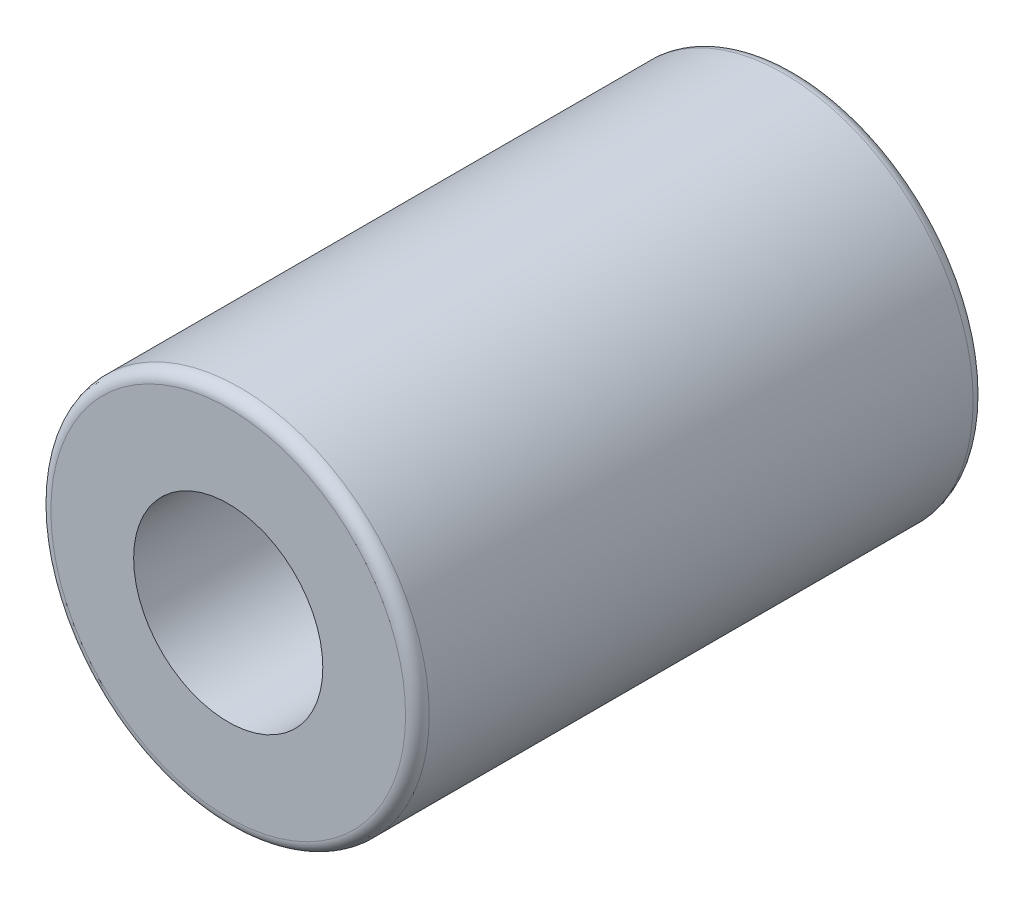
ISO-10303-21;
HEADER;
FILE_DESCRIPTION(('STEP AP214'),'2;1');
FILE_NAME('part.step','',(''),(''),'','','');
FILE_SCHEMA(('AUTOMOTIVE_DESIGN { 1 0 10303 214 1 1 1 1 }'));
ENDSEC;
DATA;
#1=APPLICATION_CONTEXT('core data for automotive mechanical design processes');
#2=APPLICATION_PROTOCOL_DEFINITION('international standard','automotive_design',2000,#1);
#3=PRODUCT_CONTEXT('',#1,'mechanical');
#4=PRODUCT('Part','Part','',(#3));
#5=PRODUCT_RELATED_PRODUCT_CATEGORY('part','',(#4));
#6=PRODUCT_DEFINITION_FORMATION('','',#4);
#7=PRODUCT_DEFINITION_CONTEXT('part definition',#1,'design');
#8=PRODUCT_DEFINITION('design','',#6,#7);
#9=PRODUCT_DEFINITION_SHAPE('','',#8);
#10=(LENGTH_UNIT() NAMED_UNIT(*) SI_UNIT(.MILLI.,.METRE.));
#11=(NAMED_UNIT(*) PLANE_ANGLE_UNIT() SI_UNIT($,.RADIAN.));
#12=(NAMED_UNIT(*) SI_UNIT($,.STERADIAN.) SOLID_ANGLE_UNIT());
#13=UNCERTAINTY_MEASURE_WITH_UNIT(LENGTH_MEASURE(1.E-05),#10,'distance_accuracy_value','');
#14=(GEOMETRIC_REPRESENTATION_CONTEXT(3) GLOBAL_UNCERTAINTY_ASSIGNED_CONTEXT((#13)) GLOBAL_UNIT_ASSIGNED_CONTEXT((#10,
#11,#12)) REPRESENTATION_CONTEXT('',''));
#15=CARTESIAN_POINT('',(0.,0.,0.));
#16=DIRECTION('',(0.,0.,1.));
#17=DIRECTION('',(1.,0.,0.));
#18=AXIS2_PLACEMENT_3D('',#15,#16,#17);
#19=CARTESIAN_POINT('',(0.,0.,12.));
#20=DIRECTION('',(0.,0.,1.));
#21=DIRECTION('',(1.,0.,0.));
#22=AXIS2_PLACEMENT_3D('',#19,#20,#21);
#23=PLANE('',#22);
#24=CARTESIAN_POINT('',(0.,0.,12.));
#25=DIRECTION('',(0.,0.,1.));
#26=DIRECTION('',(1.,0.,0.));
#27=AXIS2_PLACEMENT_3D('',#24,#25,#26);
#28=CIRCLE('',#27,3.75);
#29=CARTESIAN_POINT('',(3.75,0.,12.));
#30=VERTEX_POINT('',#29);
#31=EDGE_CURVE('E10',#30,#30,#28,.T.);
#32=ORIENTED_EDGE('',*,*,#31,.T.);
#33=EDGE_LOOP('',(#32));
#34=FACE_BOUND('',#33,.T.);
#35=CARTESIAN_POINT('',(0.,0.,12.));
#36=DIRECTION('',(0.,0.,1.));
#37=DIRECTION('',(1.,0.,0.));
#38=AXIS2_PLACEMENT_3D('',#35,#36,#37);
#39=CIRCLE('',#38,2.);
#40=CARTESIAN_POINT('',(2.,0.,12.));
#41=VERTEX_POINT('',#40);
#42=EDGE_CURVE('E51',#41,#41,#39,.T.);
#43=ORIENTED_EDGE('',*,*,#42,.F.);
#44=EDGE_LOOP('',(#43));
#45=FACE_BOUND('',#44,.T.);
#46=ADVANCED_FACE('F31',(#34,#45),#23,.T.);
#47=CARTESIAN_POINT('',(0.,0.,0.));
#48=DIRECTION('',(0.,0.,1.));
#49=DIRECTION('',(1.,0.,0.));
#50=AXIS2_PLACEMENT_3D('',#47,#48,#49);
#51=PLANE('',#50);
#52=CARTESIAN_POINT('',(0.,0.,0.));
#53=DIRECTION('',(0.,0.,1.));
#54=DIRECTION('',(1.,0.,0.));
#55=AXIS2_PLACEMENT_3D('',#52,#53,#54);
#56=CIRCLE('',#55,3.75);
#57=CARTESIAN_POINT('',(3.75,0.,0.));
#58=VERTEX_POINT('',#57);
#59=EDGE_CURVE('E38',#58,#58,#56,.F.);
#60=ORIENTED_EDGE('',*,*,#59,.T.);
#61=EDGE_LOOP('',(#60));
#62=FACE_BOUND('',#61,.T.);
#63=CARTESIAN_POINT('',(0.,0.,0.));
#64=DIRECTION('',(0.,0.,1.));
#65=DIRECTION('',(1.,0.,0.));
#66=AXIS2_PLACEMENT_3D('',#63,#64,#65);
#67=CIRCLE('',#66,2.);
#68=CARTESIAN_POINT('',(2.,0.,0.));
#69=VERTEX_POINT('',#68);
#70=EDGE_CURVE('E52',#69,#69,#67,.T.);
#71=ORIENTED_EDGE('',*,*,#70,.T.);
#72=EDGE_LOOP('',(#71));
#73=FACE_BOUND('',#72,.T.);
#74=ADVANCED_FACE('F62',(#62,#73),#51,.F.);
#75=CARTESIAN_POINT('',(0.,0.,12.));
#76=DIRECTION('',(0.,0.,-1.));
#77=DIRECTION('',(-1.,0.,0.));
#78=AXIS2_PLACEMENT_3D('',#75,#76,#77);
#79=CYLINDRICAL_SURFACE('',#78,4.);
#80=CARTESIAN_POINT('',(0.,0.,0.25));
#81=DIRECTION('',(0.,0.,1.));
#82=DIRECTION('',(1.,0.,0.));
#83=AXIS2_PLACEMENT_3D('',#80,#81,#82);
#84=CIRCLE('',#83,4.);
#85=CARTESIAN_POINT('',(4.,0.,0.25));
#86=VERTEX_POINT('',#85);
#87=EDGE_CURVE('E42',#86,#86,#84,.T.);
#88=ORIENTED_EDGE('',*,*,#87,.T.);
#89=EDGE_LOOP('',(#88));
#90=FACE_BOUND('',#89,.T.);
#91=CARTESIAN_POINT('',(0.,0.,11.75));
#92=DIRECTION('',(0.,0.,1.));
#93=DIRECTION('',(1.,0.,0.));
#94=AXIS2_PLACEMENT_3D('',#91,#92,#93);
#95=CIRCLE('',#94,4.);
#96=CARTESIAN_POINT('',(4.,0.,11.75));
#97=VERTEX_POINT('',#96);
#98=EDGE_CURVE('E46',#97,#97,#95,.F.);
#99=ORIENTED_EDGE('',*,*,#98,.T.);
#100=EDGE_LOOP('',(#99));
#101=FACE_BOUND('',#100,.T.);
#102=ADVANCED_FACE('F67',(#90,#101),#79,.T.);
#103=CARTESIAN_POINT('',(0.,0.,12.));
#104=DIRECTION('',(0.,0.,-1.));
#105=DIRECTION('',(-1.,0.,0.));
#106=AXIS2_PLACEMENT_3D('',#103,#104,#105);
#107=CYLINDRICAL_SURFACE('',#106,2.);
#108=ORIENTED_EDGE('',*,*,#42,.T.);
#109=EDGE_LOOP('',(#108));
#110=FACE_BOUND('',#109,.T.);
#111=ORIENTED_EDGE('',*,*,#70,.F.);
#112=EDGE_LOOP('',(#111));
#113=FACE_BOUND('',#112,.T.);
#114=ADVANCED_FACE('F58',(#110,#113),#107,.F.);
#115=CARTESIAN_POINT('',(0.,0.,0.25));
#116=DIRECTION('',(0.,0.,1.));
#117=DIRECTION('',(1.,0.,0.));
#118=AXIS2_PLACEMENT_3D('',#115,#116,#117);
#119=TOROIDAL_SURFACE('',#118,3.75,0.25);
#120=ORIENTED_EDGE('',*,*,#59,.F.);
#121=EDGE_LOOP('',(#120));
#122=FACE_BOUND('',#121,.T.);
#123=ORIENTED_EDGE('',*,*,#87,.F.);
#124=EDGE_LOOP('',(#123));
#125=FACE_BOUND('',#124,.T.);
#126=ADVANCED_FACE('F73',(#122,#125),#119,.T.);
#127=CARTESIAN_POINT('',(0.,0.,11.75));
#128=DIRECTION('',(0.,0.,1.));
#129=DIRECTION('',(1.,0.,0.));
#130=AXIS2_PLACEMENT_3D('',#127,#128,#129);
#131=TOROIDAL_SURFACE('',#130,3.75,0.25);
#132=ORIENTED_EDGE('',*,*,#98,.F.);
#133=EDGE_LOOP('',(#132));
#134=FACE_BOUND('',#133,.T.);
#135=ORIENTED_EDGE('',*,*,#31,.F.);
#136=EDGE_LOOP('',(#135));
#137=FACE_BOUND('',#136,.T.);
#138=ADVANCED_FACE('F33',(#134,#137),#131,.T.);
#139=CLOSED_SHELL('',(#46,#74,#102,#114,#126,#138));
#140=MANIFOLD_SOLID_BREP('B2',#139);
#141=ADVANCED_BREP_SHAPE_REPRESENTATION('',(#18,#140),#14);
#142=SHAPE_DEFINITION_REPRESENTATION(#9,#141);
ENDSEC;
END-ISO-10303-21;
